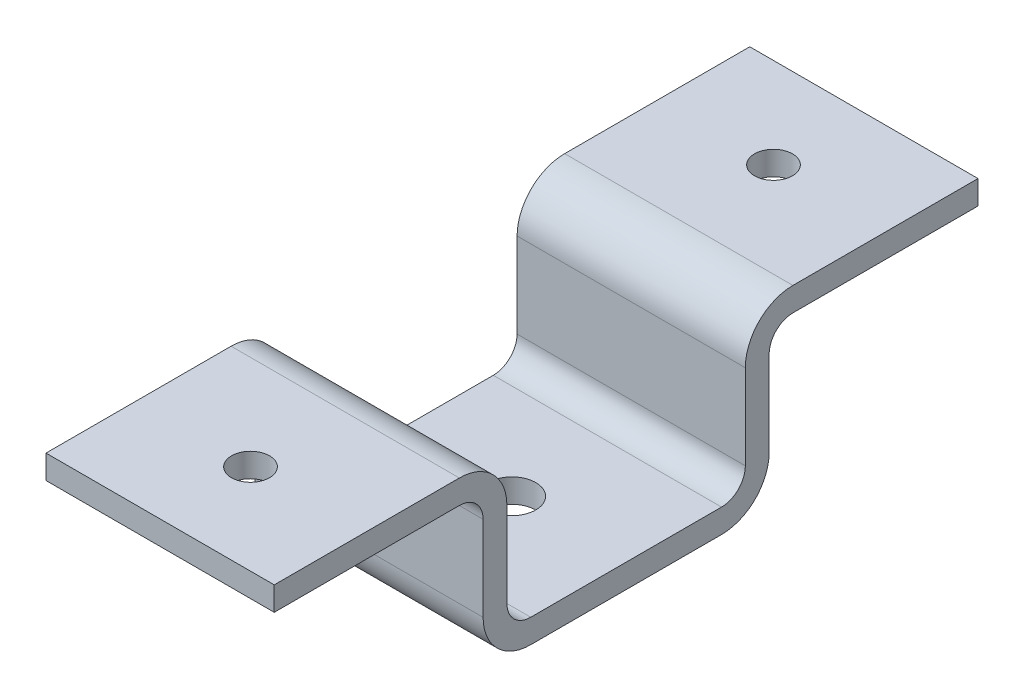
ISO-10303-21;
HEADER;
FILE_DESCRIPTION(('STEP AP214'),'2;1');
FILE_NAME('part.step','',(''),(''),'','','');
FILE_SCHEMA(('AUTOMOTIVE_DESIGN { 1 0 10303 214 1 1 1 1 }'));
ENDSEC;
DATA;
#1=APPLICATION_CONTEXT('core data for automotive mechanical design processes');
#2=APPLICATION_PROTOCOL_DEFINITION('international standard','automotive_design',2000,#1);
#3=PRODUCT_CONTEXT('',#1,'mechanical');
#4=PRODUCT('Part','Part','',(#3));
#5=PRODUCT_RELATED_PRODUCT_CATEGORY('part','',(#4));
#6=PRODUCT_DEFINITION_FORMATION('','',#4);
#7=PRODUCT_DEFINITION_CONTEXT('part definition',#1,'design');
#8=PRODUCT_DEFINITION('design','',#6,#7);
#9=PRODUCT_DEFINITION_SHAPE('','',#8);
#10=(LENGTH_UNIT() NAMED_UNIT(*) SI_UNIT(.MILLI.,.METRE.));
#11=(NAMED_UNIT(*) PLANE_ANGLE_UNIT() SI_UNIT($,.RADIAN.));
#12=(NAMED_UNIT(*) SI_UNIT($,.STERADIAN.) SOLID_ANGLE_UNIT());
#13=UNCERTAINTY_MEASURE_WITH_UNIT(LENGTH_MEASURE(1.E-05),#10,'distance_accuracy_value','');
#14=(GEOMETRIC_REPRESENTATION_CONTEXT(3) GLOBAL_UNCERTAINTY_ASSIGNED_CONTEXT((#13)) GLOBAL_UNIT_ASSIGNED_CONTEXT((#10,
#11,#12)) REPRESENTATION_CONTEXT('',''));
#15=CARTESIAN_POINT('',(0.,0.,0.));
#16=DIRECTION('',(0.,0.,1.));
#17=DIRECTION('',(1.,0.,0.));
#18=AXIS2_PLACEMENT_3D('',#15,#16,#17);
#19=CARTESIAN_POINT('',(-76.2,15.875,31.8755201513364));
#20=DIRECTION('',(1.,0.,0.));
#21=DIRECTION('',(0.,0.,-1.));
#22=AXIS2_PLACEMENT_3D('',#19,#20,#21);
#23=CYLINDRICAL_SURFACE('',#22,15.875);
#24=CARTESIAN_POINT('',(0.,15.875,31.8755201513364));
#25=DIRECTION('',(-1.,0.,0.));
#26=DIRECTION('',(0.,0.,1.));
#27=AXIS2_PLACEMENT_3D('',#24,#25,#26);
#28=CIRCLE('',#27,15.875);
#29=CARTESIAN_POINT('',(0.,0.,31.8755201513364));
#30=VERTEX_POINT('',#29);
#31=CARTESIAN_POINT('',(0.,15.875,47.7505201513364));
#32=VERTEX_POINT('',#31);
#33=EDGE_CURVE('E212',#30,#32,#28,.T.);
#34=ORIENTED_EDGE('',*,*,#33,.T.);
#35=DIRECTION('',(1.,0.,0.));
#36=VECTOR('',#35,1.);
#37=CARTESIAN_POINT('',(-76.2,15.875,47.7505201513364));
#38=LINE('',#37,#36);
#39=CARTESIAN_POINT('',(-76.2,15.875,47.7505201513364));
#40=VERTEX_POINT('',#39);
#41=EDGE_CURVE('E11',#40,#32,#38,.T.);
#42=ORIENTED_EDGE('',*,*,#41,.F.);
#43=CARTESIAN_POINT('',(-76.2,15.875,31.8755201513364));
#44=DIRECTION('',(-1.,0.,0.));
#45=DIRECTION('',(0.,0.,1.));
#46=AXIS2_PLACEMENT_3D('',#43,#44,#45);
#47=CIRCLE('',#46,15.875);
#48=CARTESIAN_POINT('',(-76.2,0.,31.8755201513364));
#49=VERTEX_POINT('',#48);
#50=EDGE_CURVE('E261',#49,#40,#47,.T.);
#51=ORIENTED_EDGE('',*,*,#50,.F.);
#52=DIRECTION('',(1.,0.,0.));
#53=VECTOR('',#52,1.);
#54=CARTESIAN_POINT('',(-76.2,0.,31.8755201513364));
#55=LINE('',#54,#53);
#56=EDGE_CURVE('E59',#49,#30,#55,.T.);
#57=ORIENTED_EDGE('',*,*,#56,.T.);
#58=EDGE_LOOP('',(#34,#42,#51,#57));
#59=FACE_BOUND('',#58,.T.);
#60=ADVANCED_FACE('F41',(#59),#23,.T.);
#61=CARTESIAN_POINT('',(-76.2,15.875,47.7505201513364));
#62=DIRECTION('',(0.,0.,-1.));
#63=DIRECTION('',(-1.,0.,0.));
#64=AXIS2_PLACEMENT_3D('',#61,#62,#63);
#65=PLANE('',#64);
#66=DIRECTION('',(0.,1.,0.));
#67=VECTOR('',#66,1.);
#68=CARTESIAN_POINT('',(0.,15.875,47.7505201513364));
#69=LINE('',#68,#67);
#70=CARTESIAN_POINT('',(0.,44.2280000038024,47.7505201513364));
#71=VERTEX_POINT('',#70);
#72=EDGE_CURVE('E214',#32,#71,#69,.T.);
#73=ORIENTED_EDGE('',*,*,#72,.T.);
#74=DIRECTION('',(1.,0.,0.));
#75=VECTOR('',#74,1.);
#76=CARTESIAN_POINT('',(-76.2,44.2280000038024,47.7505201513364));
#77=LINE('',#76,#75);
#78=CARTESIAN_POINT('',(-76.2,44.2280000038024,47.7505201513364));
#79=VERTEX_POINT('',#78);
#80=EDGE_CURVE('E50',#79,#71,#77,.T.);
#81=ORIENTED_EDGE('',*,*,#80,.F.);
#82=DIRECTION('',(0.,1.,0.));
#83=VECTOR('',#82,1.);
#84=CARTESIAN_POINT('',(-76.2,15.875,47.7505201513364));
#85=LINE('',#84,#83);
#86=EDGE_CURVE('E133',#40,#79,#85,.T.);
#87=ORIENTED_EDGE('',*,*,#86,.F.);
#88=ORIENTED_EDGE('',*,*,#41,.T.);
#89=EDGE_LOOP('',(#73,#81,#87,#88));
#90=FACE_BOUND('',#89,.T.);
#91=ADVANCED_FACE('F369',(#90),#65,.F.);
#92=CARTESIAN_POINT('',(-76.2,44.2280000038024,55.7007201513364));
#93=DIRECTION('',(1.,0.,0.));
#94=DIRECTION('',(0.,0.,-1.));
#95=AXIS2_PLACEMENT_3D('',#92,#93,#94);
#96=CYLINDRICAL_SURFACE('',#95,7.9502);
#97=CARTESIAN_POINT('',(0.,44.2280000038024,55.7007201513364));
#98=DIRECTION('',(1.,0.,0.));
#99=DIRECTION('',(0.,0.,-1.));
#100=AXIS2_PLACEMENT_3D('',#97,#98,#99);
#101=CIRCLE('',#100,7.9502);
#102=CARTESIAN_POINT('',(0.,52.1782000038024,55.7007201513364));
#103=VERTEX_POINT('',#102);
#104=EDGE_CURVE('E217',#71,#103,#101,.T.);
#105=ORIENTED_EDGE('',*,*,#104,.T.);
#106=DIRECTION('',(1.,0.,0.));
#107=VECTOR('',#106,1.);
#108=CARTESIAN_POINT('',(-76.2,52.1782000038024,55.7007201513364));
#109=LINE('',#108,#107);
#110=CARTESIAN_POINT('',(-76.2,52.1782000038024,55.7007201513364));
#111=VERTEX_POINT('',#110);
#112=EDGE_CURVE('E297',#111,#103,#109,.T.);
#113=ORIENTED_EDGE('',*,*,#112,.F.);
#114=CARTESIAN_POINT('',(-76.2,44.2280000038024,55.7007201513364));
#115=DIRECTION('',(1.,0.,0.));
#116=DIRECTION('',(0.,0.,-1.));
#117=AXIS2_PLACEMENT_3D('',#114,#115,#116);
#118=CIRCLE('',#117,7.9502);
#119=EDGE_CURVE('E316',#79,#111,#118,.T.);
#120=ORIENTED_EDGE('',*,*,#119,.F.);
#121=ORIENTED_EDGE('',*,*,#80,.T.);
#122=EDGE_LOOP('',(#105,#113,#120,#121));
#123=FACE_BOUND('',#122,.T.);
#124=ADVANCED_FACE('F373',(#123),#96,.F.);
#125=CARTESIAN_POINT('',(-76.2,52.1782000038024,55.7007201513364));
#126=DIRECTION('',(0.,1.,0.));
#127=DIRECTION('',(0.,0.,1.));
#128=AXIS2_PLACEMENT_3D('',#125,#126,#127);
#129=PLANE('',#128);
#130=CARTESIAN_POINT('',(-38.1,52.1782000038024,87.2998));
#131=DIRECTION('',(0.,1.,0.));
#132=DIRECTION('',(0.,0.,1.));
#133=AXIS2_PLACEMENT_3D('',#130,#131,#132);
#134=CIRCLE('',#133,6.35);
#135=CARTESIAN_POINT('',(-38.1,52.1782000038024,93.6498));
#136=VERTEX_POINT('',#135);
#137=EDGE_CURVE('E306',#136,#136,#134,.F.);
#138=ORIENTED_EDGE('',*,*,#137,.F.);
#139=EDGE_LOOP('',(#138));
#140=FACE_BOUND('',#139,.T.);
#141=DIRECTION('',(0.,0.,1.));
#142=VECTOR('',#141,1.);
#143=CARTESIAN_POINT('',(0.,52.1782000038024,55.7007201513364));
#144=LINE('',#143,#142);
#145=CARTESIAN_POINT('',(0.,52.1782000038024,117.475));
#146=VERTEX_POINT('',#145);
#147=EDGE_CURVE('E219',#103,#146,#144,.T.);
#148=ORIENTED_EDGE('',*,*,#147,.T.);
#149=DIRECTION('',(1.,0.,0.));
#150=VECTOR('',#149,1.);
#151=CARTESIAN_POINT('',(-76.2,52.1782000038024,117.475));
#152=LINE('',#151,#150);
#153=CARTESIAN_POINT('',(-76.2,52.1782000038024,117.475));
#154=VERTEX_POINT('',#153);
#155=EDGE_CURVE('E294',#154,#146,#152,.T.);
#156=ORIENTED_EDGE('',*,*,#155,.F.);
#157=DIRECTION('',(0.,0.,1.));
#158=VECTOR('',#157,1.);
#159=CARTESIAN_POINT('',(-76.2,52.1782000038024,55.7007201513364));
#160=LINE('',#159,#158);
#161=EDGE_CURVE('E318',#111,#154,#160,.T.);
#162=ORIENTED_EDGE('',*,*,#161,.F.);
#163=ORIENTED_EDGE('',*,*,#112,.T.);
#164=EDGE_LOOP('',(#148,#156,#162,#163));
#165=FACE_BOUND('',#164,.T.);
#166=ADVANCED_FACE('F384',(#140,#165),#129,.F.);
#167=CARTESIAN_POINT('',(-76.2,52.1782000038024,117.475));
#168=DIRECTION('',(0.,0.,-1.));
#169=DIRECTION('',(-1.,0.,0.));
#170=AXIS2_PLACEMENT_3D('',#167,#168,#169);
#171=PLANE('',#170);
#172=DIRECTION('',(0.,1.,0.));
#173=VECTOR('',#172,1.);
#174=CARTESIAN_POINT('',(0.,52.1782000038024,117.475));
#175=LINE('',#174,#173);
#176=CARTESIAN_POINT('',(0.,60.1284000038024,117.475));
#177=VERTEX_POINT('',#176);
#178=EDGE_CURVE('E221',#146,#177,#175,.T.);
#179=ORIENTED_EDGE('',*,*,#178,.T.);
#180=DIRECTION('',(1.,0.,0.));
#181=VECTOR('',#180,1.);
#182=CARTESIAN_POINT('',(-76.2,60.1284000038024,117.475));
#183=LINE('',#182,#181);
#184=CARTESIAN_POINT('',(-76.2,60.1284000038024,117.475));
#185=VERTEX_POINT('',#184);
#186=EDGE_CURVE('E291',#185,#177,#183,.T.);
#187=ORIENTED_EDGE('',*,*,#186,.F.);
#188=DIRECTION('',(0.,1.,0.));
#189=VECTOR('',#188,1.);
#190=CARTESIAN_POINT('',(-76.2,52.1782000038024,117.475));
#191=LINE('',#190,#189);
#192=EDGE_CURVE('E320',#154,#185,#191,.T.);
#193=ORIENTED_EDGE('',*,*,#192,.F.);
#194=ORIENTED_EDGE('',*,*,#155,.T.);
#195=EDGE_LOOP('',(#179,#187,#193,#194));
#196=FACE_BOUND('',#195,.T.);
#197=ADVANCED_FACE('F388',(#196),#171,.F.);
#198=CARTESIAN_POINT('',(-76.2,60.1284000038024,117.475));
#199=DIRECTION('',(0.,-1.,0.));
#200=DIRECTION('',(0.,0.,-1.));
#201=AXIS2_PLACEMENT_3D('',#198,#199,#200);
#202=PLANE('',#201);
#203=CARTESIAN_POINT('',(-38.1,60.1284000038024,87.2998));
#204=DIRECTION('',(0.,-1.,0.));
#205=DIRECTION('',(0.,0.,-1.));
#206=AXIS2_PLACEMENT_3D('',#203,#204,#205);
#207=CIRCLE('',#206,6.35);
#208=CARTESIAN_POINT('',(-38.1,60.1284000038024,93.6498));
#209=VERTEX_POINT('',#208);
#210=EDGE_CURVE('E609',#209,#209,#207,.T.);
#211=ORIENTED_EDGE('',*,*,#210,.T.);
#212=EDGE_LOOP('',(#211));
#213=FACE_BOUND('',#212,.T.);
#214=DIRECTION('',(0.,0.,-1.));
#215=VECTOR('',#214,1.);
#216=CARTESIAN_POINT('',(0.,60.1284000038024,117.475));
#217=LINE('',#216,#215);
#218=CARTESIAN_POINT('',(0.,60.1284000038024,55.6753201513364));
#219=VERTEX_POINT('',#218);
#220=EDGE_CURVE('E223',#177,#219,#217,.T.);
#221=ORIENTED_EDGE('',*,*,#220,.T.);
#222=DIRECTION('',(1.,0.,0.));
#223=VECTOR('',#222,1.);
#224=CARTESIAN_POINT('',(-76.2,60.1284000038024,55.6753201513364));
#225=LINE('',#224,#223);
#226=CARTESIAN_POINT('',(-76.2,60.1284000038024,55.6753201513364));
#227=VERTEX_POINT('',#226);
#228=EDGE_CURVE('E288',#227,#219,#225,.T.);
#229=ORIENTED_EDGE('',*,*,#228,.F.);
#230=DIRECTION('',(0.,0.,-1.));
#231=VECTOR('',#230,1.);
#232=CARTESIAN_POINT('',(-76.2,60.1284000038024,117.475));
#233=LINE('',#232,#231);
#234=EDGE_CURVE('E322',#185,#227,#233,.T.);
#235=ORIENTED_EDGE('',*,*,#234,.F.);
#236=ORIENTED_EDGE('',*,*,#186,.T.);
#237=EDGE_LOOP('',(#221,#229,#235,#236));
#238=FACE_BOUND('',#237,.T.);
#239=ADVANCED_FACE('F395',(#213,#238),#202,.F.);
#240=CARTESIAN_POINT('',(-76.2,44.2534000038024,55.6753201513364));
#241=DIRECTION('',(1.,0.,0.));
#242=DIRECTION('',(0.,0.,-1.));
#243=AXIS2_PLACEMENT_3D('',#240,#241,#242);
#244=CYLINDRICAL_SURFACE('',#243,15.875);
#245=CARTESIAN_POINT('',(0.,44.2534000038024,55.6753201513364));
#246=DIRECTION('',(-1.,0.,0.));
#247=DIRECTION('',(0.,0.,1.));
#248=AXIS2_PLACEMENT_3D('',#245,#246,#247);
#249=CIRCLE('',#248,15.875);
#250=CARTESIAN_POINT('',(0.,44.2534000038024,39.8003201513364));
#251=VERTEX_POINT('',#250);
#252=EDGE_CURVE('E225',#219,#251,#249,.T.);
#253=ORIENTED_EDGE('',*,*,#252,.T.);
#254=DIRECTION('',(1.,0.,0.));
#255=VECTOR('',#254,1.);
#256=CARTESIAN_POINT('',(-76.2,44.2534000038024,39.8003201513364));
#257=LINE('',#256,#255);
#258=CARTESIAN_POINT('',(-76.2,44.2534000038024,39.8003201513364));
#259=VERTEX_POINT('',#258);
#260=EDGE_CURVE('E285',#259,#251,#257,.T.);
#261=ORIENTED_EDGE('',*,*,#260,.F.);
#262=CARTESIAN_POINT('',(-76.2,44.2534000038024,55.6753201513364));
#263=DIRECTION('',(-1.,0.,0.));
#264=DIRECTION('',(0.,0.,1.));
#265=AXIS2_PLACEMENT_3D('',#262,#263,#264);
#266=CIRCLE('',#265,15.875);
#267=EDGE_CURVE('E324',#227,#259,#266,.T.);
#268=ORIENTED_EDGE('',*,*,#267,.F.);
#269=ORIENTED_EDGE('',*,*,#228,.T.);
#270=EDGE_LOOP('',(#253,#261,#268,#269));
#271=FACE_BOUND('',#270,.T.);
#272=ADVANCED_FACE('F398',(#271),#244,.T.);
#273=CARTESIAN_POINT('',(-76.2,44.2534000038024,39.8003201513364));
#274=DIRECTION('',(0.,0.,1.));
#275=DIRECTION('',(0.,-1.,0.));
#276=AXIS2_PLACEMENT_3D('',#273,#274,#275);
#277=PLANE('',#276);
#278=DIRECTION('',(0.,-1.,0.));
#279=VECTOR('',#278,1.);
#280=CARTESIAN_POINT('',(0.,44.2534000038024,39.8003201513364));
#281=LINE('',#280,#279);
#282=CARTESIAN_POINT('',(0.,15.9004,39.8003201513364));
#283=VERTEX_POINT('',#282);
#284=EDGE_CURVE('E227',#251,#283,#281,.T.);
#285=ORIENTED_EDGE('',*,*,#284,.T.);
#286=DIRECTION('',(1.,0.,0.));
#287=VECTOR('',#286,1.);
#288=CARTESIAN_POINT('',(-76.2,15.9004,39.8003201513364));
#289=LINE('',#288,#287);
#290=CARTESIAN_POINT('',(-76.2,15.9004,39.8003201513364));
#291=VERTEX_POINT('',#290);
#292=EDGE_CURVE('E282',#291,#283,#289,.T.);
#293=ORIENTED_EDGE('',*,*,#292,.F.);
#294=DIRECTION('',(0.,-1.,0.));
#295=VECTOR('',#294,1.);
#296=CARTESIAN_POINT('',(-76.2,44.2534000038024,39.8003201513364));
#297=LINE('',#296,#295);
#298=EDGE_CURVE('E326',#259,#291,#297,.T.);
#299=ORIENTED_EDGE('',*,*,#298,.F.);
#300=ORIENTED_EDGE('',*,*,#260,.T.);
#301=EDGE_LOOP('',(#285,#293,#299,#300));
#302=FACE_BOUND('',#301,.T.);
#303=ADVANCED_FACE('F403',(#302),#277,.F.);
#304=CARTESIAN_POINT('',(-76.2,15.9004,31.8501201513364));
#305=DIRECTION('',(1.,0.,0.));
#306=DIRECTION('',(0.,0.,-1.));
#307=AXIS2_PLACEMENT_3D('',#304,#305,#306);
#308=CYLINDRICAL_SURFACE('',#307,7.9502);
#309=CARTESIAN_POINT('',(0.,15.9004,31.8501201513364));
#310=DIRECTION('',(1.,0.,0.));
#311=DIRECTION('',(0.,0.,-1.));
#312=AXIS2_PLACEMENT_3D('',#309,#310,#311);
#313=CIRCLE('',#312,7.9502);
#314=CARTESIAN_POINT('',(0.,7.9502,31.8501201513364));
#315=VERTEX_POINT('',#314);
#316=EDGE_CURVE('E229',#283,#315,#313,.T.);
#317=ORIENTED_EDGE('',*,*,#316,.T.);
#318=DIRECTION('',(1.,0.,0.));
#319=VECTOR('',#318,1.);
#320=CARTESIAN_POINT('',(-76.2,7.9502,31.8501201513364));
#321=LINE('',#320,#319);
#322=CARTESIAN_POINT('',(-76.2,7.9502,31.8501201513364));
#323=VERTEX_POINT('',#322);
#324=EDGE_CURVE('E279',#323,#315,#321,.T.);
#325=ORIENTED_EDGE('',*,*,#324,.F.);
#326=CARTESIAN_POINT('',(-76.2,15.9004,31.8501201513364));
#327=DIRECTION('',(1.,0.,0.));
#328=DIRECTION('',(0.,0.,-1.));
#329=AXIS2_PLACEMENT_3D('',#326,#327,#328);
#330=CIRCLE('',#329,7.9502);
#331=EDGE_CURVE('E328',#291,#323,#330,.T.);
#332=ORIENTED_EDGE('',*,*,#331,.F.);
#333=ORIENTED_EDGE('',*,*,#292,.T.);
#334=EDGE_LOOP('',(#317,#325,#332,#333));
#335=FACE_BOUND('',#334,.T.);
#336=ADVANCED_FACE('F410',(#335),#308,.F.);
#337=CARTESIAN_POINT('',(-76.2,7.9502,31.8501201513364));
#338=DIRECTION('',(0.,-1.,0.));
#339=DIRECTION('',(0.,0.,-1.));
#340=AXIS2_PLACEMENT_3D('',#337,#338,#339);
#341=PLANE('',#340);
#342=CARTESIAN_POINT('',(-38.1,7.9502,0.));
#343=DIRECTION('',(0.,1.,0.));
#344=DIRECTION('',(0.,0.,1.));
#345=AXIS2_PLACEMENT_3D('',#342,#343,#344);
#346=CIRCLE('',#345,7.9375);
#347=CARTESIAN_POINT('',(-38.1,7.9502,7.9375));
#348=VERTEX_POINT('',#347);
#349=EDGE_CURVE('E302',#348,#348,#346,.T.);
#350=ORIENTED_EDGE('',*,*,#349,.F.);
#351=EDGE_LOOP('',(#350));
#352=FACE_BOUND('',#351,.T.);
#353=DIRECTION('',(0.,0.,-1.));
#354=VECTOR('',#353,1.);
#355=CARTESIAN_POINT('',(0.,7.9502,31.8501201513364));
#356=LINE('',#355,#354);
#357=CARTESIAN_POINT('',(0.,7.9502,-31.8501201513364));
#358=VERTEX_POINT('',#357);
#359=EDGE_CURVE('E231',#315,#358,#356,.T.);
#360=ORIENTED_EDGE('',*,*,#359,.T.);
#361=DIRECTION('',(1.,0.,0.));
#362=VECTOR('',#361,1.);
#363=CARTESIAN_POINT('',(-76.2,7.9502,-31.8501201513364));
#364=LINE('',#363,#362);
#365=CARTESIAN_POINT('',(-76.2,7.9502,-31.8501201513364));
#366=VERTEX_POINT('',#365);
#367=EDGE_CURVE('E277',#366,#358,#364,.T.);
#368=ORIENTED_EDGE('',*,*,#367,.F.);
#369=DIRECTION('',(0.,0.,-1.));
#370=VECTOR('',#369,1.);
#371=CARTESIAN_POINT('',(-76.2,7.9502,31.8501201513364));
#372=LINE('',#371,#370);
#373=EDGE_CURVE('E330',#323,#366,#372,.T.);
#374=ORIENTED_EDGE('',*,*,#373,.F.);
#375=ORIENTED_EDGE('',*,*,#324,.T.);
#376=EDGE_LOOP('',(#360,#368,#374,#375));
#377=FACE_BOUND('',#376,.T.);
#378=ADVANCED_FACE('F414',(#352,#377),#341,.F.);
#379=CARTESIAN_POINT('',(-76.2,15.9004,-31.8501201513364));
#380=DIRECTION('',(1.,0.,0.));
#381=DIRECTION('',(0.,0.,-1.));
#382=AXIS2_PLACEMENT_3D('',#379,#380,#381);
#383=CYLINDRICAL_SURFACE('',#382,7.9502);
#384=CARTESIAN_POINT('',(0.,15.9004,-31.8501201513364));
#385=DIRECTION('',(-1.,0.,0.));
#386=DIRECTION('',(0.,0.,1.));
#387=AXIS2_PLACEMENT_3D('',#384,#385,#386);
#388=CIRCLE('',#387,7.9502);
#389=CARTESIAN_POINT('',(0.,15.9004,-39.8003201513364));
#390=VERTEX_POINT('',#389);
#391=EDGE_CURVE('E234',#390,#358,#388,.T.);
#392=ORIENTED_EDGE('',*,*,#391,.F.);
#393=DIRECTION('',(1.,0.,0.));
#394=VECTOR('',#393,1.);
#395=CARTESIAN_POINT('',(-76.2,15.9004,-39.8003201513364));
#396=LINE('',#395,#394);
#397=CARTESIAN_POINT('',(-76.2,15.9004,-39.8003201513364));
#398=VERTEX_POINT('',#397);
#399=EDGE_CURVE('E275',#398,#390,#396,.T.);
#400=ORIENTED_EDGE('',*,*,#399,.F.);
#401=CARTESIAN_POINT('',(-76.2,15.9004,-31.8501201513364));
#402=DIRECTION('',(-1.,0.,0.));
#403=DIRECTION('',(0.,0.,1.));
#404=AXIS2_PLACEMENT_3D('',#401,#402,#403);
#405=CIRCLE('',#404,7.9502);
#406=EDGE_CURVE('E332',#398,#366,#405,.T.);
#407=ORIENTED_EDGE('',*,*,#406,.T.);
#408=ORIENTED_EDGE('',*,*,#367,.T.);
#409=EDGE_LOOP('',(#392,#400,#407,#408));
#410=FACE_BOUND('',#409,.T.);
#411=ADVANCED_FACE('F417',(#410),#383,.F.);
#412=CARTESIAN_POINT('',(-76.2,44.2534000038024,-39.8003201513364));
#413=DIRECTION('',(0.,0.,1.));
#414=DIRECTION('',(0.,-1.,0.));
#415=AXIS2_PLACEMENT_3D('',#412,#413,#414);
#416=PLANE('',#415);
#417=DIRECTION('',(0.,-1.,0.));
#418=VECTOR('',#417,1.);
#419=CARTESIAN_POINT('',(0.,44.2534000038024,-39.8003201513364));
#420=LINE('',#419,#418);
#421=CARTESIAN_POINT('',(0.,44.2534000038024,-39.8003201513364));
#422=VERTEX_POINT('',#421);
#423=EDGE_CURVE('E237',#422,#390,#420,.T.);
#424=ORIENTED_EDGE('',*,*,#423,.F.);
#425=DIRECTION('',(1.,0.,0.));
#426=VECTOR('',#425,1.);
#427=CARTESIAN_POINT('',(-76.2,44.2534000038024,-39.8003201513364));
#428=LINE('',#427,#426);
#429=CARTESIAN_POINT('',(-76.2,44.2534000038024,-39.8003201513364));
#430=VERTEX_POINT('',#429);
#431=EDGE_CURVE('E273',#430,#422,#428,.T.);
#432=ORIENTED_EDGE('',*,*,#431,.F.);
#433=DIRECTION('',(0.,-1.,0.));
#434=VECTOR('',#433,1.);
#435=CARTESIAN_POINT('',(-76.2,44.2534000038024,-39.8003201513364));
#436=LINE('',#435,#434);
#437=EDGE_CURVE('E335',#430,#398,#436,.T.);
#438=ORIENTED_EDGE('',*,*,#437,.T.);
#439=ORIENTED_EDGE('',*,*,#399,.T.);
#440=EDGE_LOOP('',(#424,#432,#438,#439));
#441=FACE_BOUND('',#440,.T.);
#442=ADVANCED_FACE('F422',(#441),#416,.T.);
#443=CARTESIAN_POINT('',(-76.2,44.2534000038024,-55.6753201513364));
#444=DIRECTION('',(1.,0.,0.));
#445=DIRECTION('',(0.,0.,-1.));
#446=AXIS2_PLACEMENT_3D('',#443,#444,#445);
#447=CYLINDRICAL_SURFACE('',#446,15.875);
#448=CARTESIAN_POINT('',(0.,44.2534000038024,-55.6753201513364));
#449=DIRECTION('',(1.,0.,0.));
#450=DIRECTION('',(0.,0.,-1.));
#451=AXIS2_PLACEMENT_3D('',#448,#449,#450);
#452=CIRCLE('',#451,15.875);
#453=CARTESIAN_POINT('',(0.,60.1284000038024,-55.6753201513364));
#454=VERTEX_POINT('',#453);
#455=EDGE_CURVE('E240',#454,#422,#452,.T.);
#456=ORIENTED_EDGE('',*,*,#455,.F.);
#457=DIRECTION('',(1.,0.,0.));
#458=VECTOR('',#457,1.);
#459=CARTESIAN_POINT('',(-76.2,60.1284000038024,-55.6753201513364));
#460=LINE('',#459,#458);
#461=CARTESIAN_POINT('',(-76.2,60.1284000038024,-55.6753201513364));
#462=VERTEX_POINT('',#461);
#463=EDGE_CURVE('E271',#462,#454,#460,.T.);
#464=ORIENTED_EDGE('',*,*,#463,.F.);
#465=CARTESIAN_POINT('',(-76.2,44.2534000038024,-55.6753201513364));
#466=DIRECTION('',(1.,0.,0.));
#467=DIRECTION('',(0.,0.,-1.));
#468=AXIS2_PLACEMENT_3D('',#465,#466,#467);
#469=CIRCLE('',#468,15.875);
#470=EDGE_CURVE('E338',#462,#430,#469,.T.);
#471=ORIENTED_EDGE('',*,*,#470,.T.);
#472=ORIENTED_EDGE('',*,*,#431,.T.);
#473=EDGE_LOOP('',(#456,#464,#471,#472));
#474=FACE_BOUND('',#473,.T.);
#475=ADVANCED_FACE('F425',(#474),#447,.T.);
#476=CARTESIAN_POINT('',(-76.2,60.1284000038024,-117.475));
#477=DIRECTION('',(0.,1.,0.));
#478=DIRECTION('',(0.,0.,1.));
#479=AXIS2_PLACEMENT_3D('',#476,#477,#478);
#480=PLANE('',#479);
#481=CARTESIAN_POINT('',(-38.1,60.1284000038024,-87.2998));
#482=DIRECTION('',(0.,1.,0.));
#483=DIRECTION('',(0.,0.,1.));
#484=AXIS2_PLACEMENT_3D('',#481,#482,#483);
#485=CIRCLE('',#484,6.35);
#486=CARTESIAN_POINT('',(-38.1,60.1284000038024,-80.9498));
#487=VERTEX_POINT('',#486);
#488=EDGE_CURVE('E611',#487,#487,#485,.T.);
#489=ORIENTED_EDGE('',*,*,#488,.F.);
#490=EDGE_LOOP('',(#489));
#491=FACE_BOUND('',#490,.T.);
#492=DIRECTION('',(0.,0.,1.));
#493=VECTOR('',#492,1.);
#494=CARTESIAN_POINT('',(0.,60.1284000038024,-117.475));
#495=LINE('',#494,#493);
#496=CARTESIAN_POINT('',(0.,60.1284000038024,-117.475));
#497=VERTEX_POINT('',#496);
#498=EDGE_CURVE('E243',#497,#454,#495,.T.);
#499=ORIENTED_EDGE('',*,*,#498,.F.);
#500=DIRECTION('',(1.,0.,0.));
#501=VECTOR('',#500,1.);
#502=CARTESIAN_POINT('',(-76.2,60.1284000038024,-117.475));
#503=LINE('',#502,#501);
#504=CARTESIAN_POINT('',(-76.2,60.1284000038024,-117.475));
#505=VERTEX_POINT('',#504);
#506=EDGE_CURVE('E269',#505,#497,#503,.T.);
#507=ORIENTED_EDGE('',*,*,#506,.F.);
#508=DIRECTION('',(0.,0.,1.));
#509=VECTOR('',#508,1.);
#510=CARTESIAN_POINT('',(-76.2,60.1284000038024,-117.475));
#511=LINE('',#510,#509);
#512=EDGE_CURVE('E341',#505,#462,#511,.T.);
#513=ORIENTED_EDGE('',*,*,#512,.T.);
#514=ORIENTED_EDGE('',*,*,#463,.T.);
#515=EDGE_LOOP('',(#499,#507,#513,#514));
#516=FACE_BOUND('',#515,.T.);
#517=ADVANCED_FACE('F430',(#491,#516),#480,.T.);
#518=CARTESIAN_POINT('',(-76.2,52.1782000038024,-117.475));
#519=DIRECTION('',(0.,0.,-1.));
#520=DIRECTION('',(-1.,0.,0.));
#521=AXIS2_PLACEMENT_3D('',#518,#519,#520);
#522=PLANE('',#521);
#523=DIRECTION('',(0.,1.,0.));
#524=VECTOR('',#523,1.);
#525=CARTESIAN_POINT('',(0.,52.1782000038024,-117.475));
#526=LINE('',#525,#524);
#527=CARTESIAN_POINT('',(0.,52.1782000038024,-117.475));
#528=VERTEX_POINT('',#527);
#529=EDGE_CURVE('E246',#528,#497,#526,.T.);
#530=ORIENTED_EDGE('',*,*,#529,.F.);
#531=DIRECTION('',(1.,0.,0.));
#532=VECTOR('',#531,1.);
#533=CARTESIAN_POINT('',(-76.2,52.1782000038024,-117.475));
#534=LINE('',#533,#532);
#535=CARTESIAN_POINT('',(-76.2,52.1782000038024,-117.475));
#536=VERTEX_POINT('',#535);
#537=EDGE_CURVE('E267',#536,#528,#534,.T.);
#538=ORIENTED_EDGE('',*,*,#537,.F.);
#539=DIRECTION('',(0.,1.,0.));
#540=VECTOR('',#539,1.);
#541=CARTESIAN_POINT('',(-76.2,52.1782000038024,-117.475));
#542=LINE('',#541,#540);
#543=EDGE_CURVE('E344',#536,#505,#542,.T.);
#544=ORIENTED_EDGE('',*,*,#543,.T.);
#545=ORIENTED_EDGE('',*,*,#506,.T.);
#546=EDGE_LOOP('',(#530,#538,#544,#545));
#547=FACE_BOUND('',#546,.T.);
#548=ADVANCED_FACE('F433',(#547),#522,.T.);
#549=CARTESIAN_POINT('',(-76.2,52.1782000038024,-55.7007201513364));
#550=DIRECTION('',(0.,-1.,0.));
#551=DIRECTION('',(0.,0.,-1.));
#552=AXIS2_PLACEMENT_3D('',#549,#550,#551);
#553=PLANE('',#552);
#554=CARTESIAN_POINT('',(-38.1,52.1782000038024,-87.2998));
#555=DIRECTION('',(0.,-1.,0.));
#556=DIRECTION('',(0.,0.,-1.));
#557=AXIS2_PLACEMENT_3D('',#554,#555,#556);
#558=CIRCLE('',#557,6.35);
#559=CARTESIAN_POINT('',(-38.1,52.1782000038024,-80.9498));
#560=VERTEX_POINT('',#559);
#561=EDGE_CURVE('E44',#560,#560,#558,.T.);
#562=ORIENTED_EDGE('',*,*,#561,.F.);
#563=EDGE_LOOP('',(#562));
#564=FACE_BOUND('',#563,.T.);
#565=DIRECTION('',(0.,0.,-1.));
#566=VECTOR('',#565,1.);
#567=CARTESIAN_POINT('',(0.,52.1782000038024,-55.7007201513364));
#568=LINE('',#567,#566);
#569=CARTESIAN_POINT('',(0.,52.1782000038024,-55.7007201513364));
#570=VERTEX_POINT('',#569);
#571=EDGE_CURVE('E249',#570,#528,#568,.T.);
#572=ORIENTED_EDGE('',*,*,#571,.F.);
#573=DIRECTION('',(1.,0.,0.));
#574=VECTOR('',#573,1.);
#575=CARTESIAN_POINT('',(-76.2,52.1782000038024,-55.7007201513364));
#576=LINE('',#575,#574);
#577=CARTESIAN_POINT('',(-76.2,52.1782000038024,-55.7007201513364));
#578=VERTEX_POINT('',#577);
#579=EDGE_CURVE('E265',#578,#570,#576,.T.);
#580=ORIENTED_EDGE('',*,*,#579,.F.);
#581=DIRECTION('',(0.,0.,-1.));
#582=VECTOR('',#581,1.);
#583=CARTESIAN_POINT('',(-76.2,52.1782000038024,-55.7007201513364));
#584=LINE('',#583,#582);
#585=EDGE_CURVE('E347',#578,#536,#584,.T.);
#586=ORIENTED_EDGE('',*,*,#585,.T.);
#587=ORIENTED_EDGE('',*,*,#537,.T.);
#588=EDGE_LOOP('',(#572,#580,#586,#587));
#589=FACE_BOUND('',#588,.T.);
#590=ADVANCED_FACE('F435',(#564,#589),#553,.T.);
#591=CARTESIAN_POINT('',(-76.2,44.2280000038024,-55.7007201513364));
#592=DIRECTION('',(1.,0.,0.));
#593=DIRECTION('',(0.,0.,-1.));
#594=AXIS2_PLACEMENT_3D('',#591,#592,#593);
#595=CYLINDRICAL_SURFACE('',#594,7.9502);
#596=CARTESIAN_POINT('',(0.,44.2280000038024,-55.7007201513364));
#597=DIRECTION('',(-1.,0.,0.));
#598=DIRECTION('',(0.,0.,1.));
#599=AXIS2_PLACEMENT_3D('',#596,#597,#598);
#600=CIRCLE('',#599,7.9502);
#601=CARTESIAN_POINT('',(0.,44.2280000038024,-47.7505201513364));
#602=VERTEX_POINT('',#601);
#603=EDGE_CURVE('E252',#602,#570,#600,.T.);
#604=ORIENTED_EDGE('',*,*,#603,.F.);
#605=DIRECTION('',(1.,0.,0.));
#606=VECTOR('',#605,1.);
#607=CARTESIAN_POINT('',(-76.2,44.2280000038024,-47.7505201513364));
#608=LINE('',#607,#606);
#609=CARTESIAN_POINT('',(-76.2,44.2280000038024,-47.7505201513364));
#610=VERTEX_POINT('',#609);
#611=EDGE_CURVE('E194',#610,#602,#608,.T.);
#612=ORIENTED_EDGE('',*,*,#611,.F.);
#613=CARTESIAN_POINT('',(-76.2,44.2280000038024,-55.7007201513364));
#614=DIRECTION('',(-1.,0.,0.));
#615=DIRECTION('',(0.,0.,1.));
#616=AXIS2_PLACEMENT_3D('',#613,#614,#615);
#617=CIRCLE('',#616,7.9502);
#618=EDGE_CURVE('E204',#610,#578,#617,.T.);
#619=ORIENTED_EDGE('',*,*,#618,.T.);
#620=ORIENTED_EDGE('',*,*,#579,.T.);
#621=EDGE_LOOP('',(#604,#612,#619,#620));
#622=FACE_BOUND('',#621,.T.);
#623=ADVANCED_FACE('F351',(#622),#595,.F.);
#624=CARTESIAN_POINT('',(-76.2,15.875,-47.7505201513364));
#625=DIRECTION('',(0.,0.,-1.));
#626=DIRECTION('',(-1.,0.,0.));
#627=AXIS2_PLACEMENT_3D('',#624,#625,#626);
#628=PLANE('',#627);
#629=DIRECTION('',(0.,1.,0.));
#630=VECTOR('',#629,1.);
#631=CARTESIAN_POINT('',(0.,15.875,-47.7505201513364));
#632=LINE('',#631,#630);
#633=CARTESIAN_POINT('',(0.,15.875,-47.7505201513364));
#634=VERTEX_POINT('',#633);
#635=EDGE_CURVE('E190',#634,#602,#632,.T.);
#636=ORIENTED_EDGE('',*,*,#635,.F.);
#637=DIRECTION('',(1.,0.,0.));
#638=VECTOR('',#637,1.);
#639=CARTESIAN_POINT('',(-76.2,15.875,-47.7505201513364));
#640=LINE('',#639,#638);
#641=CARTESIAN_POINT('',(-76.2,15.875,-47.7505201513364));
#642=VERTEX_POINT('',#641);
#643=EDGE_CURVE('E185',#642,#634,#640,.T.);
#644=ORIENTED_EDGE('',*,*,#643,.F.);
#645=DIRECTION('',(0.,1.,0.));
#646=VECTOR('',#645,1.);
#647=CARTESIAN_POINT('',(-76.2,15.875,-47.7505201513364));
#648=LINE('',#647,#646);
#649=EDGE_CURVE('E188',#642,#610,#648,.T.);
#650=ORIENTED_EDGE('',*,*,#649,.T.);
#651=ORIENTED_EDGE('',*,*,#611,.T.);
#652=EDGE_LOOP('',(#636,#644,#650,#651));
#653=FACE_BOUND('',#652,.T.);
#654=ADVANCED_FACE('F187',(#653),#628,.T.);
#655=CARTESIAN_POINT('',(-76.2,15.875,-31.8755201513364));
#656=DIRECTION('',(1.,0.,0.));
#657=DIRECTION('',(0.,0.,-1.));
#658=AXIS2_PLACEMENT_3D('',#655,#656,#657);
#659=CYLINDRICAL_SURFACE('',#658,15.875);
#660=CARTESIAN_POINT('',(0.,15.875,-31.8755201513364));
#661=DIRECTION('',(1.,0.,0.));
#662=DIRECTION('',(0.,0.,-1.));
#663=AXIS2_PLACEMENT_3D('',#660,#661,#662);
#664=CIRCLE('',#663,15.875);
#665=CARTESIAN_POINT('',(0.,0.,-31.8755201513364));
#666=VERTEX_POINT('',#665);
#667=EDGE_CURVE('E256',#666,#634,#664,.T.);
#668=ORIENTED_EDGE('',*,*,#667,.F.);
#669=DIRECTION('',(1.,0.,0.));
#670=VECTOR('',#669,1.);
#671=CARTESIAN_POINT('',(-76.2,0.,-31.8755201513364));
#672=LINE('',#671,#670);
#673=CARTESIAN_POINT('',(-76.2,0.,-31.8755201513364));
#674=VERTEX_POINT('',#673);
#675=EDGE_CURVE('E121',#674,#666,#672,.T.);
#676=ORIENTED_EDGE('',*,*,#675,.F.);
#677=CARTESIAN_POINT('',(-76.2,15.875,-31.8755201513364));
#678=DIRECTION('',(1.,0.,0.));
#679=DIRECTION('',(0.,0.,-1.));
#680=AXIS2_PLACEMENT_3D('',#677,#678,#679);
#681=CIRCLE('',#680,15.875);
#682=EDGE_CURVE('E201',#674,#642,#681,.T.);
#683=ORIENTED_EDGE('',*,*,#682,.T.);
#684=ORIENTED_EDGE('',*,*,#643,.T.);
#685=EDGE_LOOP('',(#668,#676,#683,#684));
#686=FACE_BOUND('',#685,.T.);
#687=ADVANCED_FACE('F206',(#686),#659,.T.);
#688=CARTESIAN_POINT('',(-76.2,0.,31.8755201513364));
#689=DIRECTION('',(0.,-1.,0.));
#690=DIRECTION('',(0.,0.,-1.));
#691=AXIS2_PLACEMENT_3D('',#688,#689,#690);
#692=PLANE('',#691);
#693=CARTESIAN_POINT('',(-38.1,0.,0.));
#694=DIRECTION('',(0.,-1.,0.));
#695=DIRECTION('',(0.,0.,-1.));
#696=AXIS2_PLACEMENT_3D('',#693,#694,#695);
#697=CIRCLE('',#696,7.9375);
#698=CARTESIAN_POINT('',(-38.1,0.,7.9375));
#699=VERTEX_POINT('',#698);
#700=EDGE_CURVE('E215',#699,#699,#697,.T.);
#701=ORIENTED_EDGE('',*,*,#700,.F.);
#702=EDGE_LOOP('',(#701));
#703=FACE_BOUND('',#702,.T.);
#704=DIRECTION('',(0.,0.,-1.));
#705=VECTOR('',#704,1.);
#706=CARTESIAN_POINT('',(0.,0.,31.8755201513364));
#707=LINE('',#706,#705);
#708=EDGE_CURVE('E258',#30,#666,#707,.T.);
#709=ORIENTED_EDGE('',*,*,#708,.F.);
#710=ORIENTED_EDGE('',*,*,#56,.F.);
#711=DIRECTION('',(0.,0.,-1.));
#712=VECTOR('',#711,1.);
#713=CARTESIAN_POINT('',(-76.2,0.,31.8755201513364));
#714=LINE('',#713,#712);
#715=EDGE_CURVE('E207',#49,#674,#714,.T.);
#716=ORIENTED_EDGE('',*,*,#715,.T.);
#717=ORIENTED_EDGE('',*,*,#675,.T.);
#718=EDGE_LOOP('',(#709,#710,#716,#717));
#719=FACE_BOUND('',#718,.T.);
#720=ADVANCED_FACE('F355',(#703,#719),#692,.T.);
#721=CARTESIAN_POINT('',(-76.2,15.875,31.8755201513364));
#722=DIRECTION('',(-1.,0.,0.));
#723=DIRECTION('',(0.,0.,1.));
#724=AXIS2_PLACEMENT_3D('',#721,#722,#723);
#725=PLANE('',#724);
#726=ORIENTED_EDGE('',*,*,#50,.T.);
#727=ORIENTED_EDGE('',*,*,#86,.T.);
#728=ORIENTED_EDGE('',*,*,#119,.T.);
#729=ORIENTED_EDGE('',*,*,#161,.T.);
#730=ORIENTED_EDGE('',*,*,#192,.T.);
#731=ORIENTED_EDGE('',*,*,#234,.T.);
#732=ORIENTED_EDGE('',*,*,#267,.T.);
#733=ORIENTED_EDGE('',*,*,#298,.T.);
#734=ORIENTED_EDGE('',*,*,#331,.T.);
#735=ORIENTED_EDGE('',*,*,#373,.T.);
#736=ORIENTED_EDGE('',*,*,#406,.F.);
#737=ORIENTED_EDGE('',*,*,#437,.F.);
#738=ORIENTED_EDGE('',*,*,#470,.F.);
#739=ORIENTED_EDGE('',*,*,#512,.F.);
#740=ORIENTED_EDGE('',*,*,#543,.F.);
#741=ORIENTED_EDGE('',*,*,#585,.F.);
#742=ORIENTED_EDGE('',*,*,#618,.F.);
#743=ORIENTED_EDGE('',*,*,#649,.F.);
#744=ORIENTED_EDGE('',*,*,#682,.F.);
#745=ORIENTED_EDGE('',*,*,#715,.F.);
#746=EDGE_LOOP('',(#726,#727,#728,#729,#730,#731,#732,#733,#734,#735,#736,#737,#738,#739,#740,
#741,#742,#743,#744,#745));
#747=FACE_BOUND('',#746,.T.);
#748=ADVANCED_FACE('F199',(#747),#725,.T.);
#749=CARTESIAN_POINT('',(0.,15.875,31.8755201513364));
#750=DIRECTION('',(-1.,0.,0.));
#751=DIRECTION('',(0.,0.,1.));
#752=AXIS2_PLACEMENT_3D('',#749,#750,#751);
#753=PLANE('',#752);
#754=ORIENTED_EDGE('',*,*,#33,.F.);
#755=ORIENTED_EDGE('',*,*,#708,.T.);
#756=ORIENTED_EDGE('',*,*,#667,.T.);
#757=ORIENTED_EDGE('',*,*,#635,.T.);
#758=ORIENTED_EDGE('',*,*,#603,.T.);
#759=ORIENTED_EDGE('',*,*,#571,.T.);
#760=ORIENTED_EDGE('',*,*,#529,.T.);
#761=ORIENTED_EDGE('',*,*,#498,.T.);
#762=ORIENTED_EDGE('',*,*,#455,.T.);
#763=ORIENTED_EDGE('',*,*,#423,.T.);
#764=ORIENTED_EDGE('',*,*,#391,.T.);
#765=ORIENTED_EDGE('',*,*,#359,.F.);
#766=ORIENTED_EDGE('',*,*,#316,.F.);
#767=ORIENTED_EDGE('',*,*,#284,.F.);
#768=ORIENTED_EDGE('',*,*,#252,.F.);
#769=ORIENTED_EDGE('',*,*,#220,.F.);
#770=ORIENTED_EDGE('',*,*,#178,.F.);
#771=ORIENTED_EDGE('',*,*,#147,.F.);
#772=ORIENTED_EDGE('',*,*,#104,.F.);
#773=ORIENTED_EDGE('',*,*,#72,.F.);
#774=EDGE_LOOP('',(#754,#755,#756,#757,#758,#759,#760,#761,#762,#763,#764,#765,#766,#767,#768,
#769,#770,#771,#772,#773));
#775=FACE_BOUND('',#774,.T.);
#776=ADVANCED_FACE('F354',(#775),#753,.F.);
#777=CARTESIAN_POINT('',(-38.1,-68.2498,0.));
#778=DIRECTION('',(0.,1.,0.));
#779=DIRECTION('',(0.,0.,1.));
#780=AXIS2_PLACEMENT_3D('',#777,#778,#779);
#781=CYLINDRICAL_SURFACE('',#780,7.9375);
#782=CARTESIAN_POINT('',(-38.1,0.,7.9375));
#783=CARTESIAN_POINT('',(-38.1,0.0828145833333173,7.9375));
#784=CARTESIAN_POINT('',(-38.1,0.165629166666649,7.9375));
#785=CARTESIAN_POINT('',(-38.1,0.331258333333316,7.9375));
#786=CARTESIAN_POINT('',(-38.1,0.414072916666651,7.9375));
#787=CARTESIAN_POINT('',(-38.1,0.579702083333323,7.9375));
#788=CARTESIAN_POINT('',(-38.1,0.662516666666659,7.9375));
#789=CARTESIAN_POINT('',(-38.1,0.828145833333326,7.9375));
#790=CARTESIAN_POINT('',(-38.1,0.910960416666657,7.9375));
#791=CARTESIAN_POINT('',(-38.1,1.07658958333332,7.9375));
#792=CARTESIAN_POINT('',(-38.1,1.15940416666665,7.9375));
#793=CARTESIAN_POINT('',(-38.1,1.32503333333332,7.9375));
#794=CARTESIAN_POINT('',(-38.1,1.40784791666665,7.9375));
#795=CARTESIAN_POINT('',(-38.1,1.57347708333333,7.9375));
#796=CARTESIAN_POINT('',(-38.1,1.65629166666666,7.9375));
#797=CARTESIAN_POINT('',(-38.1,1.82192083333333,7.9375));
#798=CARTESIAN_POINT('',(-38.1,1.90473541666666,7.9375));
#799=CARTESIAN_POINT('',(-38.1,2.07036458333332,7.9375));
#800=CARTESIAN_POINT('',(-38.1,2.15317916666665,7.9375));
#801=CARTESIAN_POINT('',(-38.1,2.31880833333332,7.9375));
#802=CARTESIAN_POINT('',(-38.1,2.40162291666666,7.9375));
#803=CARTESIAN_POINT('',(-38.1,2.56725208333333,7.9375));
#804=CARTESIAN_POINT('',(-38.1,2.65006666666666,7.9375));
#805=CARTESIAN_POINT('',(-38.1,2.81569583333333,7.9375));
#806=CARTESIAN_POINT('',(-38.1,2.89851041666666,7.9375));
#807=CARTESIAN_POINT('',(-38.1,3.06413958333332,7.9375));
#808=CARTESIAN_POINT('',(-38.1,3.14695416666666,7.9375));
#809=CARTESIAN_POINT('',(-38.1,3.31258333333332,7.9375));
#810=CARTESIAN_POINT('',(-38.1,3.39539791666666,7.9375));
#811=CARTESIAN_POINT('',(-38.1,3.56102708333333,7.9375));
#812=CARTESIAN_POINT('',(-38.1,3.64384166666667,7.9375));
#813=CARTESIAN_POINT('',(-38.1,3.80947083333333,7.9375));
#814=CARTESIAN_POINT('',(-38.1,3.89228541666666,7.9375));
#815=CARTESIAN_POINT('',(-38.1,4.05791458333333,7.9375));
#816=CARTESIAN_POINT('',(-38.1,4.14072916666666,7.9375));
#817=CARTESIAN_POINT('',(-38.1,4.30635833333332,7.9375));
#818=CARTESIAN_POINT('',(-38.1,4.38917291666666,7.9375));
#819=CARTESIAN_POINT('',(-38.1,4.55480208333333,7.9375));
#820=CARTESIAN_POINT('',(-38.1,4.63761666666667,7.9375));
#821=CARTESIAN_POINT('',(-38.1,4.80324583333334,7.9375));
#822=CARTESIAN_POINT('',(-38.1,4.88606041666667,7.9375));
#823=CARTESIAN_POINT('',(-38.1,5.05168958333333,7.9375));
#824=CARTESIAN_POINT('',(-38.1,5.13450416666666,7.9375));
#825=CARTESIAN_POINT('',(-38.1,5.30013333333333,7.9375));
#826=CARTESIAN_POINT('',(-38.1,5.38294791666666,7.9375));
#827=CARTESIAN_POINT('',(-38.1,5.54857708333333,7.9375));
#828=CARTESIAN_POINT('',(-38.1,5.63139166666667,7.9375));
#829=CARTESIAN_POINT('',(-38.1,5.79702083333334,7.9375));
#830=CARTESIAN_POINT('',(-38.1,5.87983541666667,7.9375));
#831=CARTESIAN_POINT('',(-38.1,6.04546458333333,7.9375));
#832=CARTESIAN_POINT('',(-38.1,6.12827916666666,7.9375));
#833=CARTESIAN_POINT('',(-38.1,6.29390833333333,7.9375));
#834=CARTESIAN_POINT('',(-38.1,6.37672291666667,7.9375));
#835=CARTESIAN_POINT('',(-38.1,6.54235208333334,7.9375));
#836=CARTESIAN_POINT('',(-38.1,6.62516666666667,7.9375));
#837=CARTESIAN_POINT('',(-38.1,6.79079583333334,7.9375));
#838=CARTESIAN_POINT('',(-38.1,6.87361041666667,7.9375));
#839=CARTESIAN_POINT('',(-38.1,7.03923958333333,7.9375));
#840=CARTESIAN_POINT('',(-38.1,7.12205416666666,7.9375));
#841=CARTESIAN_POINT('',(-38.1,7.28768333333333,7.9375));
#842=CARTESIAN_POINT('',(-38.1,7.37049791666667,7.9375));
#843=CARTESIAN_POINT('',(-38.1,7.53612708333334,7.9375));
#844=CARTESIAN_POINT('',(-38.1,7.61894166666668,7.9375));
#845=CARTESIAN_POINT('',(-38.1,7.78457083333334,7.9375));
#846=CARTESIAN_POINT('',(-38.1,7.86738541666667,7.9375));
#847=CARTESIAN_POINT('',(-38.1,7.9502,7.9375));
#848=B_SPLINE_CURVE_WITH_KNOTS('',3,(#782,#783,#784,#785,#786,#787,#788,#789,#790,#791,#792,
#793,#794,#795,#796,#797,#798,#799,#800,#801,#802,#803,#804,#805,#806,#807,#808,#809,#810,#811,
#812,#813,#814,#815,#816,#817,#818,#819,#820,#821,#822,#823,#824,#825,#826,#827,#828,#829,#830,
#831,#832,#833,#834,#835,#836,#837,#838,#839,#840,#841,#842,#843,#844,#845,#846,#847),
.UNSPECIFIED.,.F.,.F.,(4,2,2,2,2,2,2,2,2,2,2,2,2,2,2,2,2,2,2,2,2,2,2,2,2,2,2,2,2,2,2,2,4),(0.,
0.248443749999994,0.496887500000001,0.745331250000009,0.993775000000002,1.24221875,1.4906625,
1.73910625000001,1.98755,2.23599375,2.48443750000001,2.73288125000001,2.98132500000001,
3.22976875,3.47821250000001,3.72665625000002,3.97510000000001,4.22354375,4.47198750000001,
4.72043125000002,4.96887500000001,5.21731875,5.46576250000001,5.71420625000002,5.96265000000001,
6.21109375000001,6.45953750000001,6.70798125000002,6.95642500000002,7.20486875000001,
7.45331250000002,7.70175625000002,7.95020000000002),.UNSPECIFIED.);
#849=EDGE_CURVE('BSEAM550',#699,#348,#848,.T.);
#850=ORIENTED_EDGE('',*,*,#700,.T.);
#851=ORIENTED_EDGE('',*,*,#349,.T.);
#852=ORIENTED_EDGE('',*,*,#849,.T.);
#853=ORIENTED_EDGE('',*,*,#849,.F.);
#854=EDGE_LOOP('',(#850,#852,#851,#853));
#855=FACE_BOUND('',#854,.T.);
#856=ADVANCED_FACE('F550',(#855),#781,.F.);
#857=CARTESIAN_POINT('',(-38.1,-16.0715999961976,-87.2998));
#858=DIRECTION('',(0.,1.,0.));
#859=DIRECTION('',(0.,0.,1.));
#860=AXIS2_PLACEMENT_3D('',#857,#858,#859);
#861=CYLINDRICAL_SURFACE('',#860,6.35);
#862=CARTESIAN_POINT('',(-38.1,52.1782000038024,-80.9498));
#863=CARTESIAN_POINT('',(-38.1,52.2610145871357,-80.9498));
#864=CARTESIAN_POINT('',(-38.1,52.343829170469,-80.9498));
#865=CARTESIAN_POINT('',(-38.1,52.5094583371357,-80.9498));
#866=CARTESIAN_POINT('',(-38.1,52.592272920469,-80.9498));
#867=CARTESIAN_POINT('',(-38.1,52.7579020871357,-80.9498));
#868=CARTESIAN_POINT('',(-38.1,52.840716670469,-80.9498));
#869=CARTESIAN_POINT('',(-38.1,53.0063458371357,-80.9498));
#870=CARTESIAN_POINT('',(-38.1,53.089160420469,-80.9498));
#871=CARTESIAN_POINT('',(-38.1,53.2547895871357,-80.9498));
#872=CARTESIAN_POINT('',(-38.1,53.337604170469,-80.9498));
#873=CARTESIAN_POINT('',(-38.1,53.5032333371357,-80.9498));
#874=CARTESIAN_POINT('',(-38.1,53.586047920469,-80.9498));
#875=CARTESIAN_POINT('',(-38.1,53.7516770871357,-80.9498));
#876=CARTESIAN_POINT('',(-38.1,53.834491670469,-80.9498));
#877=CARTESIAN_POINT('',(-38.1,54.0001208371357,-80.9498));
#878=CARTESIAN_POINT('',(-38.1,54.082935420469,-80.9498));
#879=CARTESIAN_POINT('',(-38.1,54.2485645871357,-80.9498));
#880=CARTESIAN_POINT('',(-38.1,54.331379170469,-80.9498));
#881=CARTESIAN_POINT('',(-38.1,54.4970083371357,-80.9498));
#882=CARTESIAN_POINT('',(-38.1,54.579822920469,-80.9498));
#883=CARTESIAN_POINT('',(-38.1,54.7454520871357,-80.9498));
#884=CARTESIAN_POINT('',(-38.1,54.828266670469,-80.9498));
#885=CARTESIAN_POINT('',(-38.1,54.9938958371357,-80.9498));
#886=CARTESIAN_POINT('',(-38.1,55.076710420469,-80.9498));
#887=CARTESIAN_POINT('',(-38.1,55.2423395871357,-80.9498));
#888=CARTESIAN_POINT('',(-38.1,55.325154170469,-80.9498));
#889=CARTESIAN_POINT('',(-38.1,55.4907833371357,-80.9498));
#890=CARTESIAN_POINT('',(-38.1,55.573597920469,-80.9498));
#891=CARTESIAN_POINT('',(-38.1,55.7392270871357,-80.9498));
#892=CARTESIAN_POINT('',(-38.1,55.822041670469,-80.9498));
#893=CARTESIAN_POINT('',(-38.1,55.9876708371357,-80.9498));
#894=CARTESIAN_POINT('',(-38.1,56.070485420469,-80.9498));
#895=CARTESIAN_POINT('',(-38.1,56.2361145871357,-80.9498));
#896=CARTESIAN_POINT('',(-38.1,56.318929170469,-80.9498));
#897=CARTESIAN_POINT('',(-38.1,56.4845583371357,-80.9498));
#898=CARTESIAN_POINT('',(-38.1,56.567372920469,-80.9498));
#899=CARTESIAN_POINT('',(-38.1,56.7330020871357,-80.9498));
#900=CARTESIAN_POINT('',(-38.1,56.8158166704691,-80.9498));
#901=CARTESIAN_POINT('',(-38.1,56.9814458371357,-80.9498));
#902=CARTESIAN_POINT('',(-38.1,57.064260420469,-80.9498));
#903=CARTESIAN_POINT('',(-38.1,57.2298895871357,-80.9498));
#904=CARTESIAN_POINT('',(-38.1,57.312704170469,-80.9498));
#905=CARTESIAN_POINT('',(-38.1,57.4783333371357,-80.9498));
#906=CARTESIAN_POINT('',(-38.1,57.561147920469,-80.9498));
#907=CARTESIAN_POINT('',(-38.1,57.7267770871357,-80.9498));
#908=CARTESIAN_POINT('',(-38.1,57.8095916704691,-80.9498));
#909=CARTESIAN_POINT('',(-38.1,57.9752208371357,-80.9498));
#910=CARTESIAN_POINT('',(-38.1,58.058035420469,-80.9498));
#911=CARTESIAN_POINT('',(-38.1,58.2236645871357,-80.9498));
#912=CARTESIAN_POINT('',(-38.1,58.306479170469,-80.9498));
#913=CARTESIAN_POINT('',(-38.1,58.4721083371357,-80.9498));
#914=CARTESIAN_POINT('',(-38.1,58.5549229204691,-80.9498));
#915=CARTESIAN_POINT('',(-38.1,58.7205520871357,-80.9498));
#916=CARTESIAN_POINT('',(-38.1,58.8033666704691,-80.9498));
#917=CARTESIAN_POINT('',(-38.1,58.9689958371357,-80.9498));
#918=CARTESIAN_POINT('',(-38.1,59.0518104204691,-80.9498));
#919=CARTESIAN_POINT('',(-38.1,59.2174395871357,-80.9498));
#920=CARTESIAN_POINT('',(-38.1,59.300254170469,-80.9498));
#921=CARTESIAN_POINT('',(-38.1,59.4658833371357,-80.9498));
#922=CARTESIAN_POINT('',(-38.1,59.5486979204691,-80.9498));
#923=CARTESIAN_POINT('',(-38.1,59.7143270871357,-80.9498));
#924=CARTESIAN_POINT('',(-38.1,59.7971416704691,-80.9498));
#925=CARTESIAN_POINT('',(-38.1,59.9627708371357,-80.9498));
#926=CARTESIAN_POINT('',(-38.1,60.0455854204691,-80.9498));
#927=CARTESIAN_POINT('',(-38.1,60.1284000038024,-80.9498));
#928=B_SPLINE_CURVE_WITH_KNOTS('',3,(#862,#863,#864,#865,#866,#867,#868,#869,#870,#871,#872,
#873,#874,#875,#876,#877,#878,#879,#880,#881,#882,#883,#884,#885,#886,#887,#888,#889,#890,#891,
#892,#893,#894,#895,#896,#897,#898,#899,#900,#901,#902,#903,#904,#905,#906,#907,#908,#909,#910,
#911,#912,#913,#914,#915,#916,#917,#918,#919,#920,#921,#922,#923,#924,#925,#926,#927),
.UNSPECIFIED.,.F.,.F.,(4,2,2,2,2,2,2,2,2,2,2,2,2,2,2,2,2,2,2,2,2,2,2,2,2,2,2,2,2,2,2,2,4),(0.,
0.248443749999994,0.496887500000001,0.745331250000009,0.993775000000002,1.24221875,1.4906625,
1.73910625000001,1.98755,2.23599375,2.48443750000001,2.73288125000001,2.98132500000001,
3.22976875,3.47821250000001,3.72665625000002,3.97510000000001,4.22354375,4.47198750000001,
4.72043125000002,4.96887500000001,5.21731875,5.46576250000001,5.71420625000002,5.96265000000001,
6.21109375000001,6.45953750000001,6.70798125000002,6.95642500000002,7.20486875000001,
7.45331250000002,7.70175625000002,7.95020000000002),.UNSPECIFIED.);
#929=EDGE_CURVE('BSEAM585',#560,#487,#928,.T.);
#930=ORIENTED_EDGE('',*,*,#561,.T.);
#931=ORIENTED_EDGE('',*,*,#488,.T.);
#932=ORIENTED_EDGE('',*,*,#929,.T.);
#933=ORIENTED_EDGE('',*,*,#929,.F.);
#934=EDGE_LOOP('',(#930,#932,#931,#933));
#935=FACE_BOUND('',#934,.T.);
#936=ADVANCED_FACE('F585',(#935),#861,.F.);
#937=CARTESIAN_POINT('',(-38.1,-16.0715999961976,87.2998));
#938=DIRECTION('',(0.,1.,0.));
#939=DIRECTION('',(0.,0.,1.));
#940=AXIS2_PLACEMENT_3D('',#937,#938,#939);
#941=CYLINDRICAL_SURFACE('',#940,6.35);
#942=CARTESIAN_POINT('',(-38.1,60.1284000038024,93.6498));
#943=CARTESIAN_POINT('',(-38.1,60.0455854204691,93.6498));
#944=CARTESIAN_POINT('',(-38.1,59.9627708371357,93.6498));
#945=CARTESIAN_POINT('',(-38.1,59.7971416704691,93.6498));
#946=CARTESIAN_POINT('',(-38.1,59.7143270871357,93.6498));
#947=CARTESIAN_POINT('',(-38.1,59.5486979204691,93.6498));
#948=CARTESIAN_POINT('',(-38.1,59.4658833371357,93.6498));
#949=CARTESIAN_POINT('',(-38.1,59.300254170469,93.6498));
#950=CARTESIAN_POINT('',(-38.1,59.2174395871357,93.6498));
#951=CARTESIAN_POINT('',(-38.1,59.0518104204691,93.6498));
#952=CARTESIAN_POINT('',(-38.1,58.9689958371357,93.6498));
#953=CARTESIAN_POINT('',(-38.1,58.8033666704691,93.6498));
#954=CARTESIAN_POINT('',(-38.1,58.7205520871357,93.6498));
#955=CARTESIAN_POINT('',(-38.1,58.5549229204691,93.6498));
#956=CARTESIAN_POINT('',(-38.1,58.4721083371357,93.6498));
#957=CARTESIAN_POINT('',(-38.1,58.306479170469,93.6498));
#958=CARTESIAN_POINT('',(-38.1,58.2236645871357,93.6498));
#959=CARTESIAN_POINT('',(-38.1,58.058035420469,93.6498));
#960=CARTESIAN_POINT('',(-38.1,57.9752208371357,93.6498));
#961=CARTESIAN_POINT('',(-38.1,57.8095916704691,93.6498));
#962=CARTESIAN_POINT('',(-38.1,57.7267770871357,93.6498));
#963=CARTESIAN_POINT('',(-38.1,57.561147920469,93.6498));
#964=CARTESIAN_POINT('',(-38.1,57.4783333371357,93.6498));
#965=CARTESIAN_POINT('',(-38.1,57.312704170469,93.6498));
#966=CARTESIAN_POINT('',(-38.1,57.2298895871357,93.6498));
#967=CARTESIAN_POINT('',(-38.1,57.064260420469,93.6498));
#968=CARTESIAN_POINT('',(-38.1,56.9814458371357,93.6498));
#969=CARTESIAN_POINT('',(-38.1,56.8158166704691,93.6498));
#970=CARTESIAN_POINT('',(-38.1,56.7330020871357,93.6498));
#971=CARTESIAN_POINT('',(-38.1,56.567372920469,93.6498));
#972=CARTESIAN_POINT('',(-38.1,56.4845583371357,93.6498));
#973=CARTESIAN_POINT('',(-38.1,56.318929170469,93.6498));
#974=CARTESIAN_POINT('',(-38.1,56.2361145871357,93.6498));
#975=CARTESIAN_POINT('',(-38.1,56.070485420469,93.6498));
#976=CARTESIAN_POINT('',(-38.1,55.9876708371357,93.6498));
#977=CARTESIAN_POINT('',(-38.1,55.822041670469,93.6498));
#978=CARTESIAN_POINT('',(-38.1,55.7392270871357,93.6498));
#979=CARTESIAN_POINT('',(-38.1,55.573597920469,93.6498));
#980=CARTESIAN_POINT('',(-38.1,55.4907833371357,93.6498));
#981=CARTESIAN_POINT('',(-38.1,55.325154170469,93.6498));
#982=CARTESIAN_POINT('',(-38.1,55.2423395871357,93.6498));
#983=CARTESIAN_POINT('',(-38.1,55.076710420469,93.6498));
#984=CARTESIAN_POINT('',(-38.1,54.9938958371357,93.6498));
#985=CARTESIAN_POINT('',(-38.1,54.828266670469,93.6498));
#986=CARTESIAN_POINT('',(-38.1,54.7454520871357,93.6498));
#987=CARTESIAN_POINT('',(-38.1,54.579822920469,93.6498));
#988=CARTESIAN_POINT('',(-38.1,54.4970083371357,93.6498));
#989=CARTESIAN_POINT('',(-38.1,54.331379170469,93.6498));
#990=CARTESIAN_POINT('',(-38.1,54.2485645871357,93.6498));
#991=CARTESIAN_POINT('',(-38.1,54.082935420469,93.6498));
#992=CARTESIAN_POINT('',(-38.1,54.0001208371357,93.6498));
#993=CARTESIAN_POINT('',(-38.1,53.834491670469,93.6498));
#994=CARTESIAN_POINT('',(-38.1,53.7516770871357,93.6498));
#995=CARTESIAN_POINT('',(-38.1,53.586047920469,93.6498));
#996=CARTESIAN_POINT('',(-38.1,53.5032333371357,93.6498));
#997=CARTESIAN_POINT('',(-38.1,53.337604170469,93.6498));
#998=CARTESIAN_POINT('',(-38.1,53.2547895871357,93.6498));
#999=CARTESIAN_POINT('',(-38.1,53.089160420469,93.6498));
#1000=CARTESIAN_POINT('',(-38.1,53.0063458371357,93.6498));
#1001=CARTESIAN_POINT('',(-38.1,52.840716670469,93.6498));
#1002=CARTESIAN_POINT('',(-38.1,52.7579020871357,93.6498));
#1003=CARTESIAN_POINT('',(-38.1,52.592272920469,93.6498));
#1004=CARTESIAN_POINT('',(-38.1,52.5094583371357,93.6498));
#1005=CARTESIAN_POINT('',(-38.1,52.343829170469,93.6498));
#1006=CARTESIAN_POINT('',(-38.1,52.2610145871357,93.6498));
#1007=CARTESIAN_POINT('',(-38.1,52.1782000038024,93.6498));
#1008=B_SPLINE_CURVE_WITH_KNOTS('',3,(#942,#943,#944,#945,#946,#947,#948,#949,#950,#951,#952,
#953,#954,#955,#956,#957,#958,#959,#960,#961,#962,#963,#964,#965,#966,#967,#968,#969,#970,#971,
#972,#973,#974,#975,#976,#977,#978,#979,#980,#981,#982,#983,#984,#985,#986,#987,#988,#989,#990,
#991,#992,#993,#994,#995,#996,#997,#998,#999,#1000,#1001,#1002,#1003,#1004,#1005,#1006,#1007),
.UNSPECIFIED.,.F.,.F.,(4,2,2,2,2,2,2,2,2,2,2,2,2,2,2,2,2,2,2,2,2,2,2,2,2,2,2,2,2,2,2,2,4),(0.,
0.248443749999994,0.496887500000001,0.745331250000009,0.993775000000002,1.24221875,1.4906625,
1.73910625000001,1.98755,2.23599375,2.48443750000001,2.73288125000001,2.98132500000001,
3.22976875,3.47821250000001,3.72665625000002,3.97510000000001,4.22354375,4.47198750000001,
4.72043125000002,4.96887500000001,5.21731875,5.46576250000001,5.71420625000002,5.96265000000001,
6.21109375000001,6.45953750000001,6.70798125000002,6.95642500000002,7.20486875000001,
7.45331250000002,7.70175625000002,7.95020000000002),.UNSPECIFIED.);
#1009=EDGE_CURVE('BSEAM592',#209,#136,#1008,.T.);
#1010=ORIENTED_EDGE('',*,*,#210,.F.);
#1011=ORIENTED_EDGE('',*,*,#137,.T.);
#1012=ORIENTED_EDGE('',*,*,#1009,.T.);
#1013=ORIENTED_EDGE('',*,*,#1009,.F.);
#1014=EDGE_LOOP('',(#1010,#1012,#1011,#1013));
#1015=FACE_BOUND('',#1014,.T.);
#1016=ADVANCED_FACE('F592',(#1015),#941,.F.);
#1017=CLOSED_SHELL('',(#60,#91,#124,#166,#197,#239,#272,#303,#336,#378,#411,#442,#475,#517,#548,
#590,#623,#654,#687,#720,#748,#776,#856,#936,#1016));
#1018=MANIFOLD_SOLID_BREP('B2',#1017);
#1019=ADVANCED_BREP_SHAPE_REPRESENTATION('',(#18,#1018),#14);
#1020=SHAPE_DEFINITION_REPRESENTATION(#9,#1019);
ENDSEC;
END-ISO-10303-21;
